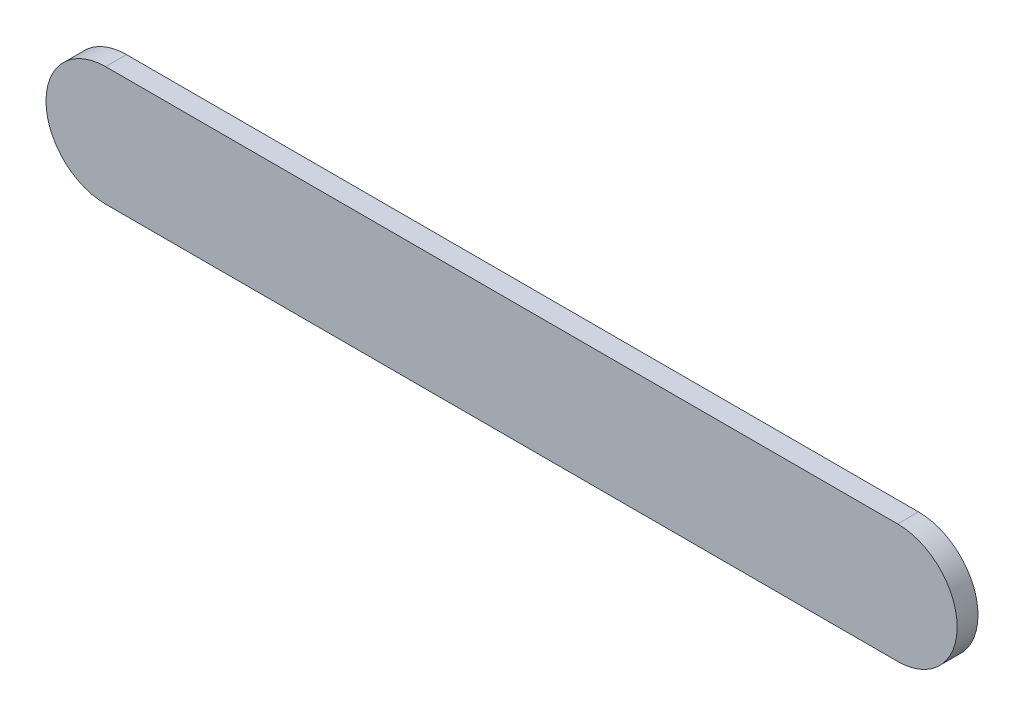
ISO-10303-21;
HEADER;
FILE_DESCRIPTION(('STEP AP214'),'2;1');
FILE_NAME('part.step','',(''),(''),'','','');
FILE_SCHEMA(('AUTOMOTIVE_DESIGN { 1 0 10303 214 1 1 1 1 }'));
ENDSEC;
DATA;
#1=APPLICATION_CONTEXT('core data for automotive mechanical design processes');
#2=APPLICATION_PROTOCOL_DEFINITION('international standard','automotive_design',2000,#1);
#3=PRODUCT_CONTEXT('',#1,'mechanical');
#4=PRODUCT('Part','Part','',(#3));
#5=PRODUCT_RELATED_PRODUCT_CATEGORY('part','',(#4));
#6=PRODUCT_DEFINITION_FORMATION('','',#4);
#7=PRODUCT_DEFINITION_CONTEXT('part definition',#1,'design');
#8=PRODUCT_DEFINITION('design','',#6,#7);
#9=PRODUCT_DEFINITION_SHAPE('','',#8);
#10=(LENGTH_UNIT() NAMED_UNIT(*) SI_UNIT(.MILLI.,.METRE.));
#11=(NAMED_UNIT(*) PLANE_ANGLE_UNIT() SI_UNIT($,.RADIAN.));
#12=(NAMED_UNIT(*) SI_UNIT($,.STERADIAN.) SOLID_ANGLE_UNIT());
#13=UNCERTAINTY_MEASURE_WITH_UNIT(LENGTH_MEASURE(1.E-05),#10,'distance_accuracy_value','');
#14=(GEOMETRIC_REPRESENTATION_CONTEXT(3) GLOBAL_UNCERTAINTY_ASSIGNED_CONTEXT((#13)) GLOBAL_UNIT_ASSIGNED_CONTEXT((#10,
#11,#12)) REPRESENTATION_CONTEXT('',''));
#15=CARTESIAN_POINT('',(0.,0.,0.));
#16=DIRECTION('',(0.,0.,1.));
#17=DIRECTION('',(1.,0.,0.));
#18=AXIS2_PLACEMENT_3D('',#15,#16,#17);
#19=CARTESIAN_POINT('',(89.9,-137.31,1.635));
#20=DIRECTION('',(0.,0.,1.));
#21=DIRECTION('',(1.,0.,0.));
#22=AXIS2_PLACEMENT_3D('',#19,#20,#21);
#23=PLANE('',#22);
#24=DIRECTION('',(-1.,0.,0.));
#25=VECTOR('',#24,1.);
#26=CARTESIAN_POINT('',(89.9,-137.31,1.635));
#27=LINE('',#26,#25);
#28=CARTESIAN_POINT('',(89.9,-137.31,1.635));
#29=VERTEX_POINT('',#28);
#30=CARTESIAN_POINT('',(88.57,-137.31,1.635));
#31=VERTEX_POINT('',#30);
#32=EDGE_CURVE('E98',#29,#31,#27,.T.);
#33=ORIENTED_EDGE('',*,*,#32,.T.);
#34=CARTESIAN_POINT('',(88.57,-137.41,1.635));
#35=DIRECTION('',(0.,0.,1.));
#36=DIRECTION('',(1.42108547152E-13,1.,0.));
#37=AXIS2_PLACEMENT_3D('',#34,#35,#36);
#38=CIRCLE('',#37,0.09999999999999);
#39=CARTESIAN_POINT('',(88.57,-137.51,1.635));
#40=VERTEX_POINT('',#39);
#41=EDGE_CURVE('E77',#31,#40,#38,.T.);
#42=ORIENTED_EDGE('',*,*,#41,.T.);
#43=DIRECTION('',(1.,0.,0.));
#44=VECTOR('',#43,1.);
#45=CARTESIAN_POINT('',(88.57,-137.51,1.635));
#46=LINE('',#45,#44);
#47=CARTESIAN_POINT('',(89.9,-137.51,1.635));
#48=VERTEX_POINT('',#47);
#49=EDGE_CURVE('E82',#40,#48,#46,.T.);
#50=ORIENTED_EDGE('',*,*,#49,.T.);
#51=CARTESIAN_POINT('',(89.9,-137.41,1.635));
#52=DIRECTION('',(0.,0.,1.));
#53=DIRECTION('',(-1.42108547152E-13,-1.,0.));
#54=AXIS2_PLACEMENT_3D('',#51,#52,#53);
#55=CIRCLE('',#54,0.09999999999999);
#56=EDGE_CURVE('E11',#48,#29,#55,.T.);
#57=ORIENTED_EDGE('',*,*,#56,.T.);
#58=EDGE_LOOP('',(#33,#42,#50,#57));
#59=FACE_BOUND('',#58,.T.);
#60=ADVANCED_FACE('F17',(#59),#23,.T.);
#61=CARTESIAN_POINT('',(89.9,-137.31,1.6));
#62=DIRECTION('',(0.,0.,1.));
#63=DIRECTION('',(1.,0.,0.));
#64=AXIS2_PLACEMENT_3D('',#61,#62,#63);
#65=PLANE('',#64);
#66=CARTESIAN_POINT('',(89.9,-137.41,1.6));
#67=DIRECTION('',(0.,0.,1.));
#68=DIRECTION('',(-1.42108547152E-13,-1.,0.));
#69=AXIS2_PLACEMENT_3D('',#66,#67,#68);
#70=CIRCLE('',#69,0.09999999999999);
#71=CARTESIAN_POINT('',(89.9,-137.51,1.6));
#72=VERTEX_POINT('',#71);
#73=CARTESIAN_POINT('',(89.9,-137.31,1.6));
#74=VERTEX_POINT('',#73);
#75=EDGE_CURVE('E20',#72,#74,#70,.T.);
#76=ORIENTED_EDGE('',*,*,#75,.F.);
#77=DIRECTION('',(1.,0.,0.));
#78=VECTOR('',#77,1.);
#79=CARTESIAN_POINT('',(88.57,-137.51,1.6));
#80=LINE('',#79,#78);
#81=CARTESIAN_POINT('',(88.57,-137.51,1.6));
#82=VERTEX_POINT('',#81);
#83=EDGE_CURVE('E67',#82,#72,#80,.T.);
#84=ORIENTED_EDGE('',*,*,#83,.F.);
#85=CARTESIAN_POINT('',(88.57,-137.41,1.6));
#86=DIRECTION('',(0.,0.,1.));
#87=DIRECTION('',(1.42108547152E-13,1.,0.));
#88=AXIS2_PLACEMENT_3D('',#85,#86,#87);
#89=CIRCLE('',#88,0.09999999999999);
#90=CARTESIAN_POINT('',(88.57,-137.31,1.6));
#91=VERTEX_POINT('',#90);
#92=EDGE_CURVE('E71',#91,#82,#89,.T.);
#93=ORIENTED_EDGE('',*,*,#92,.F.);
#94=DIRECTION('',(-1.,0.,0.));
#95=VECTOR('',#94,1.);
#96=CARTESIAN_POINT('',(89.9,-137.31,1.6));
#97=LINE('',#96,#95);
#98=EDGE_CURVE('E117',#74,#91,#97,.T.);
#99=ORIENTED_EDGE('',*,*,#98,.F.);
#100=EDGE_LOOP('',(#76,#84,#93,#99));
#101=FACE_BOUND('',#100,.T.);
#102=ADVANCED_FACE('F69',(#101),#65,.F.);
#103=CARTESIAN_POINT('',(89.9,-137.41,1.6));
#104=DIRECTION('',(0.,0.,-1.));
#105=DIRECTION('',(-1.42108547152E-13,-1.,0.));
#106=AXIS2_PLACEMENT_3D('',#103,#104,#105);
#107=CYLINDRICAL_SURFACE('',#106,0.09999999999999);
#108=ORIENTED_EDGE('',*,*,#75,.T.);
#109=DIRECTION('',(0.,0.,1.));
#110=VECTOR('',#109,1.);
#111=CARTESIAN_POINT('',(89.9,-137.31,1.6));
#112=LINE('',#111,#110);
#113=EDGE_CURVE('E92',#74,#29,#112,.T.);
#114=ORIENTED_EDGE('',*,*,#113,.T.);
#115=ORIENTED_EDGE('',*,*,#56,.F.);
#116=DIRECTION('',(0.,0.,1.));
#117=VECTOR('',#116,1.);
#118=CARTESIAN_POINT('',(89.9,-137.51,1.6));
#119=LINE('',#118,#117);
#120=EDGE_CURVE('E76',#72,#48,#119,.T.);
#121=ORIENTED_EDGE('',*,*,#120,.F.);
#122=EDGE_LOOP('',(#108,#114,#115,#121));
#123=FACE_BOUND('',#122,.T.);
#124=ADVANCED_FACE('F113',(#123),#107,.T.);
#125=CARTESIAN_POINT('',(88.57,-137.51,1.6));
#126=DIRECTION('',(0.,1.,0.));
#127=DIRECTION('',(1.,0.,0.));
#128=AXIS2_PLACEMENT_3D('',#125,#126,#127);
#129=PLANE('',#128);
#130=ORIENTED_EDGE('',*,*,#83,.T.);
#131=ORIENTED_EDGE('',*,*,#120,.T.);
#132=ORIENTED_EDGE('',*,*,#49,.F.);
#133=DIRECTION('',(0.,0.,1.));
#134=VECTOR('',#133,1.);
#135=CARTESIAN_POINT('',(88.57,-137.51,1.6));
#136=LINE('',#135,#134);
#137=EDGE_CURVE('E80',#82,#40,#136,.T.);
#138=ORIENTED_EDGE('',*,*,#137,.F.);
#139=EDGE_LOOP('',(#130,#131,#132,#138));
#140=FACE_BOUND('',#139,.T.);
#141=ADVANCED_FACE('F81',(#140),#129,.F.);
#142=CARTESIAN_POINT('',(88.57,-137.41,1.6));
#143=DIRECTION('',(0.,0.,-1.));
#144=DIRECTION('',(1.42108547152E-13,1.,0.));
#145=AXIS2_PLACEMENT_3D('',#142,#143,#144);
#146=CYLINDRICAL_SURFACE('',#145,0.09999999999999);
#147=ORIENTED_EDGE('',*,*,#92,.T.);
#148=ORIENTED_EDGE('',*,*,#137,.T.);
#149=ORIENTED_EDGE('',*,*,#41,.F.);
#150=DIRECTION('',(0.,0.,1.));
#151=VECTOR('',#150,1.);
#152=CARTESIAN_POINT('',(88.57,-137.31,1.6));
#153=LINE('',#152,#151);
#154=EDGE_CURVE('E89',#91,#31,#153,.T.);
#155=ORIENTED_EDGE('',*,*,#154,.F.);
#156=EDGE_LOOP('',(#147,#148,#149,#155));
#157=FACE_BOUND('',#156,.T.);
#158=ADVANCED_FACE('F87',(#157),#146,.T.);
#159=CARTESIAN_POINT('',(89.9,-137.31,1.6));
#160=DIRECTION('',(0.,-1.,0.));
#161=DIRECTION('',(0.,0.,-1.));
#162=AXIS2_PLACEMENT_3D('',#159,#160,#161);
#163=PLANE('',#162);
#164=ORIENTED_EDGE('',*,*,#98,.T.);
#165=ORIENTED_EDGE('',*,*,#154,.T.);
#166=ORIENTED_EDGE('',*,*,#32,.F.);
#167=ORIENTED_EDGE('',*,*,#113,.F.);
#168=EDGE_LOOP('',(#164,#165,#166,#167));
#169=FACE_BOUND('',#168,.T.);
#170=ADVANCED_FACE('F116',(#169),#163,.F.);
#171=CLOSED_SHELL('',(#60,#102,#124,#141,#158,#170));
#172=MANIFOLD_SOLID_BREP('B1',#171);
#173=ADVANCED_BREP_SHAPE_REPRESENTATION('',(#18,#172),#14);
#174=SHAPE_DEFINITION_REPRESENTATION(#9,#173);
ENDSEC;
END-ISO-10303-21;
